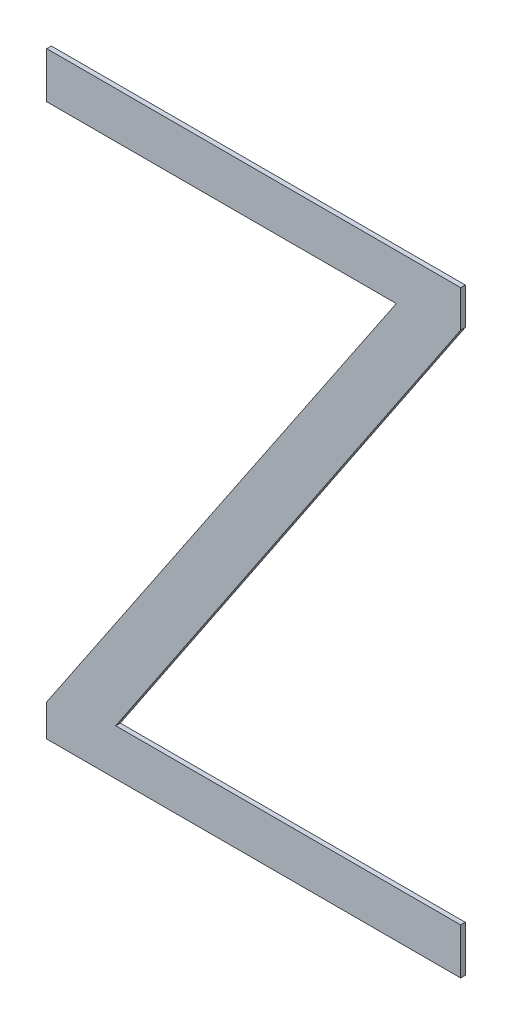
ISO-10303-21;
HEADER;
FILE_DESCRIPTION(('STEP AP214'),'2;1');
FILE_NAME('part.step','',(''),(''),'','','');
FILE_SCHEMA(('AUTOMOTIVE_DESIGN { 1 0 10303 214 1 1 1 1 }'));
ENDSEC;
DATA;
#1=APPLICATION_CONTEXT('core data for automotive mechanical design processes');
#2=APPLICATION_PROTOCOL_DEFINITION('international standard','automotive_design',2000,#1);
#3=PRODUCT_CONTEXT('',#1,'mechanical');
#4=PRODUCT('Part','Part','',(#3));
#5=PRODUCT_RELATED_PRODUCT_CATEGORY('part','',(#4));
#6=PRODUCT_DEFINITION_FORMATION('','',#4);
#7=PRODUCT_DEFINITION_CONTEXT('part definition',#1,'design');
#8=PRODUCT_DEFINITION('design','',#6,#7);
#9=PRODUCT_DEFINITION_SHAPE('','',#8);
#10=(LENGTH_UNIT() NAMED_UNIT(*) SI_UNIT(.MILLI.,.METRE.));
#11=(NAMED_UNIT(*) PLANE_ANGLE_UNIT() SI_UNIT($,.RADIAN.));
#12=(NAMED_UNIT(*) SI_UNIT($,.STERADIAN.) SOLID_ANGLE_UNIT());
#13=UNCERTAINTY_MEASURE_WITH_UNIT(LENGTH_MEASURE(1.E-05),#10,'distance_accuracy_value','');
#14=(GEOMETRIC_REPRESENTATION_CONTEXT(3) GLOBAL_UNCERTAINTY_ASSIGNED_CONTEXT((#13)) GLOBAL_UNIT_ASSIGNED_CONTEXT((#10,
#11,#12)) REPRESENTATION_CONTEXT('',''));
#15=CARTESIAN_POINT('',(0.,0.,0.));
#16=DIRECTION('',(0.,0.,1.));
#17=DIRECTION('',(1.,0.,0.));
#18=AXIS2_PLACEMENT_3D('',#15,#16,#17);
#19=CARTESIAN_POINT('',(-0.4499991,0.65000124,0.01));
#20=DIRECTION('',(0.,0.,1.));
#21=DIRECTION('',(1.,0.,0.));
#22=AXIS2_PLACEMENT_3D('',#19,#20,#21);
#23=PLANE('',#22);
#24=DIRECTION('',(0.,1.,0.));
#25=VECTOR('',#24,1.);
#26=CARTESIAN_POINT('',(0.4499991,0.65000124,0.01));
#27=LINE('',#26,#25);
#28=CARTESIAN_POINT('',(0.4499991,0.65000124,0.01));
#29=VERTEX_POINT('',#28);
#30=CARTESIAN_POINT('',(0.4499991,0.5700014,0.01));
#31=VERTEX_POINT('',#30);
#32=EDGE_CURVE('E137',#29,#31,#27,.F.);
#33=ORIENTED_EDGE('',*,*,#32,.F.);
#34=DIRECTION('',(1.,0.,0.));
#35=VECTOR('',#34,1.);
#36=CARTESIAN_POINT('',(-0.4499991,0.65000124,0.01));
#37=LINE('',#36,#35);
#38=CARTESIAN_POINT('',(-0.4499991,0.65000124,0.01));
#39=VERTEX_POINT('',#38);
#40=EDGE_CURVE('E106',#39,#29,#37,.T.);
#41=ORIENTED_EDGE('',*,*,#40,.F.);
#42=DIRECTION('',(0.,1.,0.));
#43=VECTOR('',#42,1.);
#44=CARTESIAN_POINT('',(-0.4499991,0.55000144,0.01));
#45=LINE('',#44,#43);
#46=CARTESIAN_POINT('',(-0.4499991,0.55000144,0.01));
#47=VERTEX_POINT('',#46);
#48=EDGE_CURVE('E20',#47,#39,#45,.T.);
#49=ORIENTED_EDGE('',*,*,#48,.F.);
#50=DIRECTION('',(1.,0.,0.));
#51=VECTOR('',#50,1.);
#52=CARTESIAN_POINT('',(0.30999938,0.55000144,0.01));
#53=LINE('',#52,#51);
#54=CARTESIAN_POINT('',(0.309999380000117,0.550001439999921,0.01));
#55=VERTEX_POINT('',#54);
#56=EDGE_CURVE('E95',#55,#47,#53,.F.);
#57=ORIENTED_EDGE('',*,*,#56,.F.);
#58=DIRECTION('',(-0.55808390954795,-0.829784520163925,0.));
#59=VECTOR('',#58,1.);
#60=CARTESIAN_POINT('',(-0.4499991,-0.57999884,0.01));
#61=LINE('',#60,#59);
#62=CARTESIAN_POINT('',(-0.4499991,-0.57999884,0.01));
#63=VERTEX_POINT('',#62);
#64=EDGE_CURVE('E90',#63,#55,#61,.F.);
#65=ORIENTED_EDGE('',*,*,#64,.F.);
#66=DIRECTION('',(0.,1.,0.));
#67=VECTOR('',#66,1.);
#68=CARTESIAN_POINT('',(-0.4499991,-0.6499987,0.01));
#69=LINE('',#68,#67);
#70=CARTESIAN_POINT('',(-0.4499991,-0.6499987,0.01));
#71=VERTEX_POINT('',#70);
#72=EDGE_CURVE('E117',#71,#63,#69,.T.);
#73=ORIENTED_EDGE('',*,*,#72,.F.);
#74=DIRECTION('',(1.,0.,0.));
#75=VECTOR('',#74,1.);
#76=CARTESIAN_POINT('',(0.4499991,-0.6499987,0.01));
#77=LINE('',#76,#75);
#78=CARTESIAN_POINT('',(0.4499991,-0.6499987,0.01));
#79=VERTEX_POINT('',#78);
#80=EDGE_CURVE('E121',#79,#71,#77,.F.);
#81=ORIENTED_EDGE('',*,*,#80,.F.);
#82=DIRECTION('',(0.,1.,0.));
#83=VECTOR('',#82,1.);
#84=CARTESIAN_POINT('',(0.4499991,-0.5499989,0.01));
#85=LINE('',#84,#83);
#86=CARTESIAN_POINT('',(0.4499991,-0.5499989,0.01));
#87=VERTEX_POINT('',#86);
#88=EDGE_CURVE('E125',#87,#79,#85,.F.);
#89=ORIENTED_EDGE('',*,*,#88,.F.);
#90=DIRECTION('',(1.,0.,0.));
#91=VECTOR('',#90,1.);
#92=CARTESIAN_POINT('',(-0.2999994,-0.5499989,0.01));
#93=LINE('',#92,#91);
#94=CARTESIAN_POINT('',(-0.299999400000157,-0.549998899999895,0.01));
#95=VERTEX_POINT('',#94);
#96=EDGE_CURVE('E129',#95,#87,#93,.T.);
#97=ORIENTED_EDGE('',*,*,#96,.F.);
#98=DIRECTION('',(0.556410184812978,0.830907760365967,0.));
#99=VECTOR('',#98,1.);
#100=CARTESIAN_POINT('',(0.4499991,0.5700014,0.01));
#101=LINE('',#100,#99);
#102=EDGE_CURVE('E133',#31,#95,#101,.F.);
#103=ORIENTED_EDGE('',*,*,#102,.F.);
#104=EDGE_LOOP('',(#33,#41,#49,#57,#65,#73,#81,#89,#97,#103));
#105=FACE_BOUND('',#104,.T.);
#106=ADVANCED_FACE('F17',(#105),#23,.T.);
#107=CARTESIAN_POINT('',(-0.4499991,0.55000144,0.));
#108=DIRECTION('',(-1.,0.,0.));
#109=DIRECTION('',(0.,0.,1.));
#110=AXIS2_PLACEMENT_3D('',#107,#108,#109);
#111=PLANE('',#110);
#112=DIRECTION('',(0.,0.,1.));
#113=VECTOR('',#112,1.);
#114=CARTESIAN_POINT('',(-0.4499991,0.65000124,0.));
#115=LINE('',#114,#113);
#116=CARTESIAN_POINT('',(-0.4499991,0.65000124,0.));
#117=VERTEX_POINT('',#116);
#118=EDGE_CURVE('E141',#117,#39,#115,.T.);
#119=ORIENTED_EDGE('',*,*,#118,.F.);
#120=DIRECTION('',(0.,1.,0.));
#121=VECTOR('',#120,1.);
#122=CARTESIAN_POINT('',(-0.4499991,0.65000124,0.));
#123=LINE('',#122,#121);
#124=CARTESIAN_POINT('',(-0.4499991,0.55000144,0.));
#125=VERTEX_POINT('',#124);
#126=EDGE_CURVE('E112',#117,#125,#123,.F.);
#127=ORIENTED_EDGE('',*,*,#126,.T.);
#128=DIRECTION('',(0.,0.,-1.));
#129=VECTOR('',#128,1.);
#130=CARTESIAN_POINT('',(-0.4499991,0.55000144,0.));
#131=LINE('',#130,#129);
#132=EDGE_CURVE('E100',#47,#125,#131,.T.);
#133=ORIENTED_EDGE('',*,*,#132,.F.);
#134=ORIENTED_EDGE('',*,*,#48,.T.);
#135=EDGE_LOOP('',(#119,#127,#133,#134));
#136=FACE_BOUND('',#135,.T.);
#137=ADVANCED_FACE('F111',(#136),#111,.T.);
#138=CARTESIAN_POINT('',(0.30999938,0.55000144,0.));
#139=DIRECTION('',(0.,-1.,0.));
#140=DIRECTION('',(0.,0.,-1.));
#141=AXIS2_PLACEMENT_3D('',#138,#139,#140);
#142=PLANE('',#141);
#143=ORIENTED_EDGE('',*,*,#132,.T.);
#144=DIRECTION('',(1.,0.,0.));
#145=VECTOR('',#144,1.);
#146=CARTESIAN_POINT('',(-0.4499991,0.55000144,0.));
#147=LINE('',#146,#145);
#148=CARTESIAN_POINT('',(0.309999380000117,0.550001439999921,0.));
#149=VERTEX_POINT('',#148);
#150=EDGE_CURVE('E146',#125,#149,#147,.T.);
#151=ORIENTED_EDGE('',*,*,#150,.T.);
#152=DIRECTION('',(0.,0.,1.));
#153=VECTOR('',#152,1.);
#154=CARTESIAN_POINT('',(0.309999380000469,0.550001439999684,0.));
#155=LINE('',#154,#153);
#156=EDGE_CURVE('E102',#55,#149,#155,.F.);
#157=ORIENTED_EDGE('',*,*,#156,.F.);
#158=ORIENTED_EDGE('',*,*,#56,.T.);
#159=EDGE_LOOP('',(#143,#151,#157,#158));
#160=FACE_BOUND('',#159,.T.);
#161=ADVANCED_FACE('F97',(#160),#142,.T.);
#162=CARTESIAN_POINT('',(-0.4499991,-0.57999884,0.));
#163=DIRECTION('',(-0.829784520163925,0.55808390954795,0.));
#164=DIRECTION('',(-0.55808390954795,-0.829784520163925,0.));
#165=AXIS2_PLACEMENT_3D('',#162,#163,#164);
#166=PLANE('',#165);
#167=ORIENTED_EDGE('',*,*,#156,.T.);
#168=DIRECTION('',(-0.558083909547605,-0.829784520164157,0.));
#169=VECTOR('',#168,1.);
#170=CARTESIAN_POINT('',(0.30999938,0.55000144,0.));
#171=LINE('',#170,#169);
#172=CARTESIAN_POINT('',(-0.4499991,-0.57999884,0.));
#173=VERTEX_POINT('',#172);
#174=EDGE_CURVE('E148',#149,#173,#171,.T.);
#175=ORIENTED_EDGE('',*,*,#174,.T.);
#176=DIRECTION('',(0.,0.,1.));
#177=VECTOR('',#176,1.);
#178=CARTESIAN_POINT('',(-0.4499991,-0.57999884,0.));
#179=LINE('',#178,#177);
#180=EDGE_CURVE('E119',#63,#173,#179,.F.);
#181=ORIENTED_EDGE('',*,*,#180,.F.);
#182=ORIENTED_EDGE('',*,*,#64,.T.);
#183=EDGE_LOOP('',(#167,#175,#181,#182));
#184=FACE_BOUND('',#183,.T.);
#185=ADVANCED_FACE('F198',(#184),#166,.T.);
#186=CARTESIAN_POINT('',(-0.4499991,-0.6499987,0.));
#187=DIRECTION('',(-1.,0.,0.));
#188=DIRECTION('',(0.,0.,1.));
#189=AXIS2_PLACEMENT_3D('',#186,#187,#188);
#190=PLANE('',#189);
#191=ORIENTED_EDGE('',*,*,#180,.T.);
#192=DIRECTION('',(0.,1.,0.));
#193=VECTOR('',#192,1.);
#194=CARTESIAN_POINT('',(-0.4499991,0.65000124,0.));
#195=LINE('',#194,#193);
#196=CARTESIAN_POINT('',(-0.4499991,-0.6499987,0.));
#197=VERTEX_POINT('',#196);
#198=EDGE_CURVE('E151',#173,#197,#195,.F.);
#199=ORIENTED_EDGE('',*,*,#198,.T.);
#200=DIRECTION('',(0.,0.,-1.));
#201=VECTOR('',#200,1.);
#202=CARTESIAN_POINT('',(-0.4499991,-0.6499987,0.));
#203=LINE('',#202,#201);
#204=EDGE_CURVE('E123',#71,#197,#203,.T.);
#205=ORIENTED_EDGE('',*,*,#204,.F.);
#206=ORIENTED_EDGE('',*,*,#72,.T.);
#207=EDGE_LOOP('',(#191,#199,#205,#206));
#208=FACE_BOUND('',#207,.T.);
#209=ADVANCED_FACE('F197',(#208),#190,.T.);
#210=CARTESIAN_POINT('',(0.4499991,-0.6499987,0.));
#211=DIRECTION('',(0.,-1.,0.));
#212=DIRECTION('',(0.,0.,-1.));
#213=AXIS2_PLACEMENT_3D('',#210,#211,#212);
#214=PLANE('',#213);
#215=ORIENTED_EDGE('',*,*,#204,.T.);
#216=DIRECTION('',(1.,0.,0.));
#217=VECTOR('',#216,1.);
#218=CARTESIAN_POINT('',(-0.4499991,-0.6499987,0.));
#219=LINE('',#218,#217);
#220=CARTESIAN_POINT('',(0.4499991,-0.6499987,0.));
#221=VERTEX_POINT('',#220);
#222=EDGE_CURVE('E154',#197,#221,#219,.T.);
#223=ORIENTED_EDGE('',*,*,#222,.T.);
#224=DIRECTION('',(0.,0.,-1.));
#225=VECTOR('',#224,1.);
#226=CARTESIAN_POINT('',(0.4499991,-0.6499987,0.));
#227=LINE('',#226,#225);
#228=EDGE_CURVE('E127',#79,#221,#227,.T.);
#229=ORIENTED_EDGE('',*,*,#228,.F.);
#230=ORIENTED_EDGE('',*,*,#80,.T.);
#231=EDGE_LOOP('',(#215,#223,#229,#230));
#232=FACE_BOUND('',#231,.T.);
#233=ADVANCED_FACE('F191',(#232),#214,.T.);
#234=CARTESIAN_POINT('',(0.4499991,-0.5499989,0.));
#235=DIRECTION('',(1.,0.,0.));
#236=DIRECTION('',(0.,0.,-1.));
#237=AXIS2_PLACEMENT_3D('',#234,#235,#236);
#238=PLANE('',#237);
#239=ORIENTED_EDGE('',*,*,#228,.T.);
#240=DIRECTION('',(0.,1.,0.));
#241=VECTOR('',#240,1.);
#242=CARTESIAN_POINT('',(0.4499991,0.65000124,0.));
#243=LINE('',#242,#241);
#244=CARTESIAN_POINT('',(0.4499991,-0.5499989,0.));
#245=VERTEX_POINT('',#244);
#246=EDGE_CURVE('E157',#221,#245,#243,.T.);
#247=ORIENTED_EDGE('',*,*,#246,.T.);
#248=DIRECTION('',(0.,0.,1.));
#249=VECTOR('',#248,1.);
#250=CARTESIAN_POINT('',(0.4499991,-0.5499989,0.));
#251=LINE('',#250,#249);
#252=EDGE_CURVE('E131',#87,#245,#251,.F.);
#253=ORIENTED_EDGE('',*,*,#252,.F.);
#254=ORIENTED_EDGE('',*,*,#88,.T.);
#255=EDGE_LOOP('',(#239,#247,#253,#254));
#256=FACE_BOUND('',#255,.T.);
#257=ADVANCED_FACE('F187',(#256),#238,.T.);
#258=CARTESIAN_POINT('',(-0.2999994,-0.5499989,0.));
#259=DIRECTION('',(0.,1.,0.));
#260=DIRECTION('',(0.,0.,1.));
#261=AXIS2_PLACEMENT_3D('',#258,#259,#260);
#262=PLANE('',#261);
#263=ORIENTED_EDGE('',*,*,#252,.T.);
#264=DIRECTION('',(1.,0.,0.));
#265=VECTOR('',#264,1.);
#266=CARTESIAN_POINT('',(-0.4499991,-0.5499989,0.));
#267=LINE('',#266,#265);
#268=CARTESIAN_POINT('',(-0.299999400000157,-0.549998899999895,0.));
#269=VERTEX_POINT('',#268);
#270=EDGE_CURVE('E160',#245,#269,#267,.F.);
#271=ORIENTED_EDGE('',*,*,#270,.T.);
#272=DIRECTION('',(0.,0.,1.));
#273=VECTOR('',#272,1.);
#274=CARTESIAN_POINT('',(-0.299999400000628,-0.549998899999579,0.));
#275=LINE('',#274,#273);
#276=EDGE_CURVE('E135',#95,#269,#275,.F.);
#277=ORIENTED_EDGE('',*,*,#276,.F.);
#278=ORIENTED_EDGE('',*,*,#96,.T.);
#279=EDGE_LOOP('',(#263,#271,#277,#278));
#280=FACE_BOUND('',#279,.T.);
#281=ADVANCED_FACE('F181',(#280),#262,.T.);
#282=CARTESIAN_POINT('',(0.4499991,0.5700014,0.));
#283=DIRECTION('',(0.830907760365967,-0.556410184812978,0.));
#284=DIRECTION('',(0.556410184812978,0.830907760365967,0.));
#285=AXIS2_PLACEMENT_3D('',#282,#283,#284);
#286=PLANE('',#285);
#287=ORIENTED_EDGE('',*,*,#276,.T.);
#288=DIRECTION('',(0.556410184812512,0.830907760366279,0.));
#289=VECTOR('',#288,1.);
#290=CARTESIAN_POINT('',(-0.2999994,-0.5499989,0.));
#291=LINE('',#290,#289);
#292=CARTESIAN_POINT('',(0.4499991,0.5700014,0.));
#293=VERTEX_POINT('',#292);
#294=EDGE_CURVE('E163',#269,#293,#291,.T.);
#295=ORIENTED_EDGE('',*,*,#294,.T.);
#296=DIRECTION('',(0.,0.,-1.));
#297=VECTOR('',#296,1.);
#298=CARTESIAN_POINT('',(0.4499991,0.5700014,0.));
#299=LINE('',#298,#297);
#300=EDGE_CURVE('E139',#31,#293,#299,.T.);
#301=ORIENTED_EDGE('',*,*,#300,.F.);
#302=ORIENTED_EDGE('',*,*,#102,.T.);
#303=EDGE_LOOP('',(#287,#295,#301,#302));
#304=FACE_BOUND('',#303,.T.);
#305=ADVANCED_FACE('F176',(#304),#286,.T.);
#306=CARTESIAN_POINT('',(0.4499991,0.65000124,0.));
#307=DIRECTION('',(1.,0.,0.));
#308=DIRECTION('',(0.,0.,-1.));
#309=AXIS2_PLACEMENT_3D('',#306,#307,#308);
#310=PLANE('',#309);
#311=ORIENTED_EDGE('',*,*,#300,.T.);
#312=DIRECTION('',(0.,1.,0.));
#313=VECTOR('',#312,1.);
#314=CARTESIAN_POINT('',(0.4499991,0.65000124,0.));
#315=LINE('',#314,#313);
#316=CARTESIAN_POINT('',(0.4499991,0.65000124,0.));
#317=VERTEX_POINT('',#316);
#318=EDGE_CURVE('E26',#293,#317,#315,.T.);
#319=ORIENTED_EDGE('',*,*,#318,.T.);
#320=DIRECTION('',(0.,0.,1.));
#321=VECTOR('',#320,1.);
#322=CARTESIAN_POINT('',(0.4499991,0.65000124,0.));
#323=LINE('',#322,#321);
#324=EDGE_CURVE('E34',#29,#317,#323,.F.);
#325=ORIENTED_EDGE('',*,*,#324,.F.);
#326=ORIENTED_EDGE('',*,*,#32,.T.);
#327=EDGE_LOOP('',(#311,#319,#325,#326));
#328=FACE_BOUND('',#327,.T.);
#329=ADVANCED_FACE('F169',(#328),#310,.T.);
#330=CARTESIAN_POINT('',(-0.4499991,0.65000124,0.));
#331=DIRECTION('',(0.,1.,0.));
#332=DIRECTION('',(0.,0.,1.));
#333=AXIS2_PLACEMENT_3D('',#330,#331,#332);
#334=PLANE('',#333);
#335=ORIENTED_EDGE('',*,*,#324,.T.);
#336=DIRECTION('',(1.,0.,0.));
#337=VECTOR('',#336,1.);
#338=CARTESIAN_POINT('',(-0.4499991,0.65000124,0.));
#339=LINE('',#338,#337);
#340=EDGE_CURVE('E11',#317,#117,#339,.F.);
#341=ORIENTED_EDGE('',*,*,#340,.T.);
#342=ORIENTED_EDGE('',*,*,#118,.T.);
#343=ORIENTED_EDGE('',*,*,#40,.T.);
#344=EDGE_LOOP('',(#335,#341,#342,#343));
#345=FACE_BOUND('',#344,.T.);
#346=ADVANCED_FACE('F199',(#345),#334,.T.);
#347=CARTESIAN_POINT('',(-0.4499991,0.65000124,0.));
#348=DIRECTION('',(0.,0.,1.));
#349=DIRECTION('',(1.,0.,0.));
#350=AXIS2_PLACEMENT_3D('',#347,#348,#349);
#351=PLANE('',#350);
#352=ORIENTED_EDGE('',*,*,#318,.F.);
#353=ORIENTED_EDGE('',*,*,#294,.F.);
#354=ORIENTED_EDGE('',*,*,#270,.F.);
#355=ORIENTED_EDGE('',*,*,#246,.F.);
#356=ORIENTED_EDGE('',*,*,#222,.F.);
#357=ORIENTED_EDGE('',*,*,#198,.F.);
#358=ORIENTED_EDGE('',*,*,#174,.F.);
#359=ORIENTED_EDGE('',*,*,#150,.F.);
#360=ORIENTED_EDGE('',*,*,#126,.F.);
#361=ORIENTED_EDGE('',*,*,#340,.F.);
#362=EDGE_LOOP('',(#352,#353,#354,#355,#356,#357,#358,#359,#360,#361));
#363=FACE_BOUND('',#362,.T.);
#364=ADVANCED_FACE('F173',(#363),#351,.F.);
#365=CLOSED_SHELL('',(#106,#137,#161,#185,#209,#233,#257,#281,#305,#329,#346,#364));
#366=MANIFOLD_SOLID_BREP('B1',#365);
#367=ADVANCED_BREP_SHAPE_REPRESENTATION('',(#18,#366),#14);
#368=SHAPE_DEFINITION_REPRESENTATION(#9,#367);
ENDSEC;
END-ISO-10303-21;
